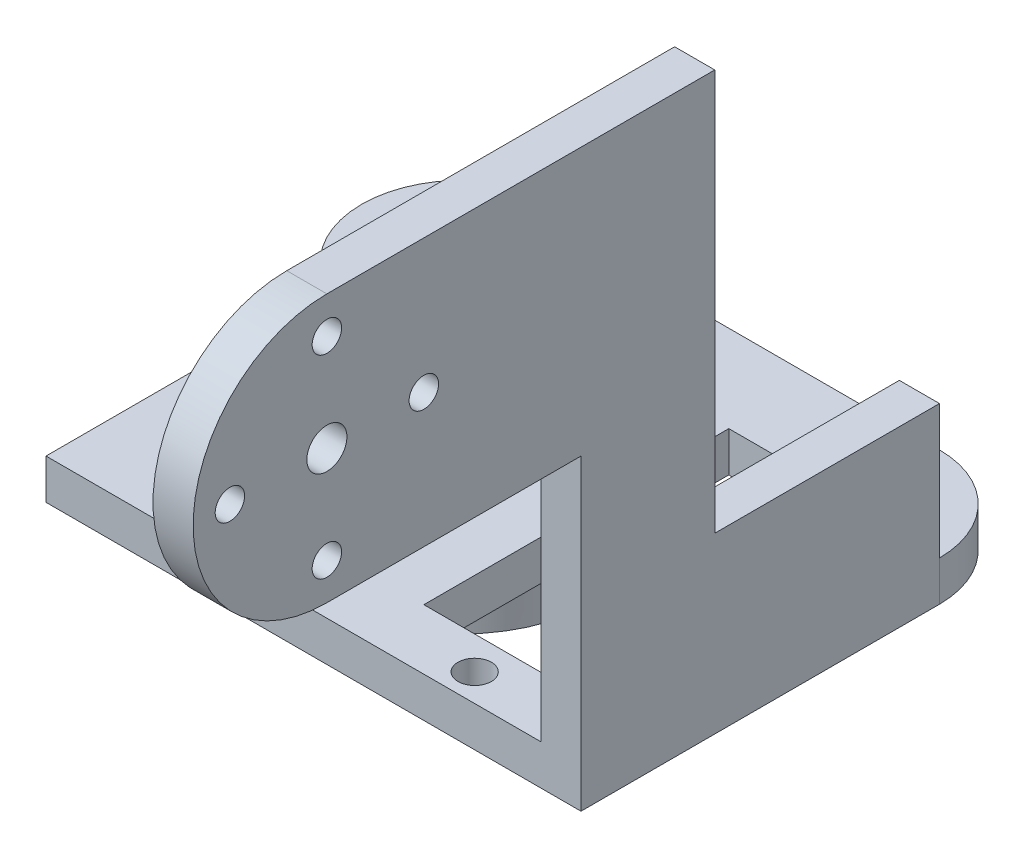
ISO-10303-21;
HEADER;
FILE_DESCRIPTION(('STEP AP214'),'2;1');
FILE_NAME('part.step','',(''),(''),'','','');
FILE_SCHEMA(('AUTOMOTIVE_DESIGN { 1 0 10303 214 1 1 1 1 }'));
ENDSEC;
DATA;
#1=APPLICATION_CONTEXT('core data for automotive mechanical design processes');
#2=APPLICATION_PROTOCOL_DEFINITION('international standard','automotive_design',2000,#1);
#3=PRODUCT_CONTEXT('',#1,'mechanical');
#4=PRODUCT('Part','Part','',(#3));
#5=PRODUCT_RELATED_PRODUCT_CATEGORY('part','',(#4));
#6=PRODUCT_DEFINITION_FORMATION('','',#4);
#7=PRODUCT_DEFINITION_CONTEXT('part definition',#1,'design');
#8=PRODUCT_DEFINITION('design','',#6,#7);
#9=PRODUCT_DEFINITION_SHAPE('','',#8);
#10=(LENGTH_UNIT() NAMED_UNIT(*) SI_UNIT(.MILLI.,.METRE.));
#11=(NAMED_UNIT(*) PLANE_ANGLE_UNIT() SI_UNIT($,.RADIAN.));
#12=(NAMED_UNIT(*) SI_UNIT($,.STERADIAN.) SOLID_ANGLE_UNIT());
#13=UNCERTAINTY_MEASURE_WITH_UNIT(LENGTH_MEASURE(1.E-05),#10,'distance_accuracy_value','');
#14=(GEOMETRIC_REPRESENTATION_CONTEXT(3) GLOBAL_UNCERTAINTY_ASSIGNED_CONTEXT((#13)) GLOBAL_UNIT_ASSIGNED_CONTEXT((#10,
#11,#12)) REPRESENTATION_CONTEXT('',''));
#15=CARTESIAN_POINT('',(0.,0.,0.));
#16=DIRECTION('',(0.,0.,1.));
#17=DIRECTION('',(1.,0.,0.));
#18=AXIS2_PLACEMENT_3D('',#15,#16,#17);
#19=CARTESIAN_POINT('',(-13.,0.,-10.9));
#20=DIRECTION('',(0.,-1.,0.));
#21=DIRECTION('',(0.,0.,-1.));
#22=AXIS2_PLACEMENT_3D('',#19,#20,#21);
#23=PLANE('',#22);
#24=CARTESIAN_POINT('',(-10.,0.,-5.2));
#25=DIRECTION('',(0.,1.,0.));
#26=DIRECTION('',(0.,0.,1.));
#27=AXIS2_PLACEMENT_3D('',#24,#25,#26);
#28=CIRCLE('',#27,4.5);
#29=CARTESIAN_POINT('',(-10.,0.,-0.700000000000002));
#30=VERTEX_POINT('',#29);
#31=EDGE_CURVE('E247',#30,#30,#28,.T.);
#32=ORIENTED_EDGE('',*,*,#31,.T.);
#33=EDGE_LOOP('',(#32));
#34=FACE_BOUND('',#33,.T.);
#35=CARTESIAN_POINT('',(-10.,0.,-5.2));
#36=DIRECTION('',(0.,-1.,0.));
#37=DIRECTION('',(0.,0.,-1.));
#38=AXIS2_PLACEMENT_3D('',#35,#36,#37);
#39=CIRCLE('',#38,7.5);
#40=CARTESIAN_POINT('',(-10.,0.,-12.7));
#41=VERTEX_POINT('',#40);
#42=EDGE_CURVE('E363',#41,#41,#39,.T.);
#43=ORIENTED_EDGE('',*,*,#42,.T.);
#44=EDGE_LOOP('',(#43));
#45=FACE_BOUND('',#44,.T.);
#46=ADVANCED_FACE('F35',(#34,#45),#23,.T.);
#47=CARTESIAN_POINT('',(-13.,3.,-10.9));
#48=DIRECTION('',(0.,-1.,0.));
#49=DIRECTION('',(0.,0.,-1.));
#50=AXIS2_PLACEMENT_3D('',#47,#48,#49);
#51=PLANE('',#50);
#52=CARTESIAN_POINT('',(10.,3.,13.85));
#53=DIRECTION('',(0.,1.,0.));
#54=DIRECTION('',(0.,0.,1.));
#55=AXIS2_PLACEMENT_3D('',#52,#53,#54);
#56=CIRCLE('',#55,1.25);
#57=CARTESIAN_POINT('',(10.,3.,15.1));
#58=VERTEX_POINT('',#57);
#59=EDGE_CURVE('E260',#58,#58,#56,.T.);
#60=ORIENTED_EDGE('',*,*,#59,.F.);
#61=EDGE_LOOP('',(#60));
#62=FACE_BOUND('',#61,.T.);
#63=CARTESIAN_POINT('',(10.,3.,-13.85));
#64=DIRECTION('',(0.,1.,0.));
#65=DIRECTION('',(0.,0.,1.));
#66=AXIS2_PLACEMENT_3D('',#63,#64,#65);
#67=CIRCLE('',#66,1.25);
#68=CARTESIAN_POINT('',(10.,3.,-12.6));
#69=VERTEX_POINT('',#68);
#70=EDGE_CURVE('E256',#69,#69,#67,.T.);
#71=ORIENTED_EDGE('',*,*,#70,.F.);
#72=EDGE_LOOP('',(#71));
#73=FACE_BOUND('',#72,.T.);
#74=DIRECTION('',(0.,0.,1.));
#75=VECTOR('',#74,1.);
#76=CARTESIAN_POINT('',(3.75,3.,-11.4));
#77=LINE('',#76,#75);
#78=CARTESIAN_POINT('',(3.75,3.,-11.4));
#79=VERTEX_POINT('',#78);
#80=CARTESIAN_POINT('',(3.75,3.,11.4));
#81=VERTEX_POINT('',#80);
#82=EDGE_CURVE('E239',#79,#81,#77,.T.);
#83=ORIENTED_EDGE('',*,*,#82,.F.);
#84=DIRECTION('',(-1.,0.,0.));
#85=VECTOR('',#84,1.);
#86=CARTESIAN_POINT('',(3.75,3.,-11.4));
#87=LINE('',#86,#85);
#88=CARTESIAN_POINT('',(16.25,3.,-11.4));
#89=VERTEX_POINT('',#88);
#90=EDGE_CURVE('E235',#89,#79,#87,.T.);
#91=ORIENTED_EDGE('',*,*,#90,.F.);
#92=DIRECTION('',(0.,0.,-1.));
#93=VECTOR('',#92,1.);
#94=CARTESIAN_POINT('',(16.25,3.,-11.4));
#95=LINE('',#94,#93);
#96=CARTESIAN_POINT('',(16.25,3.,11.4));
#97=VERTEX_POINT('',#96);
#98=EDGE_CURVE('E249',#97,#89,#95,.T.);
#99=ORIENTED_EDGE('',*,*,#98,.F.);
#100=DIRECTION('',(1.,0.,0.));
#101=VECTOR('',#100,1.);
#102=CARTESIAN_POINT('',(3.75,3.,11.4));
#103=LINE('',#102,#101);
#104=EDGE_CURVE('E251',#81,#97,#103,.T.);
#105=ORIENTED_EDGE('',*,*,#104,.F.);
#106=EDGE_LOOP('',(#83,#91,#99,#105));
#107=FACE_BOUND('',#106,.T.);
#108=DIRECTION('',(1.,0.,0.));
#109=VECTOR('',#108,1.);
#110=CARTESIAN_POINT('',(-20.,3.,15.9));
#111=LINE('',#110,#109);
#112=CARTESIAN_POINT('',(-20.,3.,15.9));
#113=VERTEX_POINT('',#112);
#114=CARTESIAN_POINT('',(17.,3.,15.9));
#115=VERTEX_POINT('',#114);
#116=EDGE_CURVE('E187',#113,#115,#111,.T.);
#117=ORIENTED_EDGE('',*,*,#116,.T.);
#118=DIRECTION('',(0.,0.,-1.));
#119=VECTOR('',#118,1.);
#120=CARTESIAN_POINT('',(17.,3.,-10.9));
#121=LINE('',#120,#119);
#122=CARTESIAN_POINT('',(17.,3.,-10.9));
#123=VERTEX_POINT('',#122);
#124=EDGE_CURVE('E272',#115,#123,#121,.T.);
#125=ORIENTED_EDGE('',*,*,#124,.T.);
#126=DIRECTION('',(1.,0.,0.));
#127=VECTOR('',#126,1.);
#128=CARTESIAN_POINT('',(17.,3.,-10.9));
#129=LINE('',#128,#127);
#130=CARTESIAN_POINT('',(20.,3.,-10.9));
#131=VERTEX_POINT('',#130);
#132=EDGE_CURVE('E266',#123,#131,#129,.T.);
#133=ORIENTED_EDGE('',*,*,#132,.T.);
#134=CARTESIAN_POINT('',(13.,3.,-10.9));
#135=DIRECTION('',(0.,1.,0.));
#136=DIRECTION('',(0.,0.,-1.));
#137=AXIS2_PLACEMENT_3D('',#134,#135,#136);
#138=CIRCLE('',#137,7.);
#139=CARTESIAN_POINT('',(13.,3.,-17.9));
#140=VERTEX_POINT('',#139);
#141=EDGE_CURVE('E182',#131,#140,#138,.T.);
#142=ORIENTED_EDGE('',*,*,#141,.T.);
#143=DIRECTION('',(-1.,0.,0.));
#144=VECTOR('',#143,1.);
#145=CARTESIAN_POINT('',(-13.,3.,-17.9));
#146=LINE('',#145,#144);
#147=CARTESIAN_POINT('',(-13.,3.,-17.9));
#148=VERTEX_POINT('',#147);
#149=EDGE_CURVE('E226',#140,#148,#146,.T.);
#150=ORIENTED_EDGE('',*,*,#149,.T.);
#151=CARTESIAN_POINT('',(-13.,3.,-10.9));
#152=DIRECTION('',(0.,1.,0.));
#153=DIRECTION('',(0.,0.,-1.));
#154=AXIS2_PLACEMENT_3D('',#151,#152,#153);
#155=CIRCLE('',#154,7.);
#156=CARTESIAN_POINT('',(-20.,3.,-10.9));
#157=VERTEX_POINT('',#156);
#158=EDGE_CURVE('E223',#148,#157,#155,.T.);
#159=ORIENTED_EDGE('',*,*,#158,.T.);
#160=DIRECTION('',(0.,0.,1.));
#161=VECTOR('',#160,1.);
#162=CARTESIAN_POINT('',(-20.,3.,15.9));
#163=LINE('',#162,#161);
#164=EDGE_CURVE('E225',#157,#113,#163,.T.);
#165=ORIENTED_EDGE('',*,*,#164,.T.);
#166=EDGE_LOOP('',(#117,#125,#133,#142,#150,#159,#165));
#167=FACE_BOUND('',#166,.T.);
#168=CARTESIAN_POINT('',(-10.,3.,-5.2));
#169=DIRECTION('',(0.,-1.,0.));
#170=DIRECTION('',(0.,0.,-1.));
#171=AXIS2_PLACEMENT_3D('',#168,#169,#170);
#172=CIRCLE('',#171,7.5);
#173=CARTESIAN_POINT('',(-10.,3.,-12.7));
#174=VERTEX_POINT('',#173);
#175=EDGE_CURVE('E11',#174,#174,#172,.F.);
#176=ORIENTED_EDGE('',*,*,#175,.F.);
#177=EDGE_LOOP('',(#176));
#178=FACE_BOUND('',#177,.T.);
#179=ADVANCED_FACE('F389',(#62,#73,#107,#167,#178),#51,.F.);
#180=CARTESIAN_POINT('',(10.,0.,-13.85));
#181=DIRECTION('',(0.,1.,0.));
#182=DIRECTION('',(0.,0.,1.));
#183=AXIS2_PLACEMENT_3D('',#180,#181,#182);
#184=CIRCLE('',#183,1.25);
#185=CARTESIAN_POINT('',(10.,0.,-12.6));
#186=VERTEX_POINT('',#185);
#187=EDGE_CURVE('E257',#186,#186,#184,.T.);
#188=ORIENTED_EDGE('',*,*,#187,.T.);
#189=EDGE_LOOP('',(#188));
#190=FACE_BOUND('',#189,.T.);
#191=DIRECTION('',(-1.,0.,0.));
#192=VECTOR('',#191,1.);
#193=CARTESIAN_POINT('',(3.75,0.,-11.4));
#194=LINE('',#193,#192);
#195=CARTESIAN_POINT('',(16.25,0.,-11.4));
#196=VERTEX_POINT('',#195);
#197=CARTESIAN_POINT('',(3.75000000000001,0.,-11.4));
#198=VERTEX_POINT('',#197);
#199=EDGE_CURVE('E236',#196,#198,#194,.T.);
#200=ORIENTED_EDGE('',*,*,#199,.T.);
#201=DIRECTION('',(0.,0.,1.));
#202=VECTOR('',#201,1.);
#203=CARTESIAN_POINT('',(3.75,0.,-11.4));
#204=LINE('',#203,#202);
#205=CARTESIAN_POINT('',(3.75,0.,11.4));
#206=VERTEX_POINT('',#205);
#207=EDGE_CURVE('E58',#198,#206,#204,.T.);
#208=ORIENTED_EDGE('',*,*,#207,.T.);
#209=DIRECTION('',(1.,0.,0.));
#210=VECTOR('',#209,1.);
#211=CARTESIAN_POINT('',(3.75,0.,11.4));
#212=LINE('',#211,#210);
#213=CARTESIAN_POINT('',(16.25,0.,11.4));
#214=VERTEX_POINT('',#213);
#215=EDGE_CURVE('E243',#206,#214,#212,.T.);
#216=ORIENTED_EDGE('',*,*,#215,.T.);
#217=DIRECTION('',(0.,0.,-1.));
#218=VECTOR('',#217,1.);
#219=CARTESIAN_POINT('',(16.25,0.,-11.4));
#220=LINE('',#219,#218);
#221=EDGE_CURVE('E240',#214,#196,#220,.T.);
#222=ORIENTED_EDGE('',*,*,#221,.T.);
#223=EDGE_LOOP('',(#200,#208,#216,#222));
#224=FACE_BOUND('',#223,.T.);
#225=DIRECTION('',(0.,0.,1.));
#226=VECTOR('',#225,1.);
#227=CARTESIAN_POINT('',(-20.,0.,15.9));
#228=LINE('',#227,#226);
#229=CARTESIAN_POINT('',(-20.,0.,-5.2));
#230=VERTEX_POINT('',#229);
#231=CARTESIAN_POINT('',(-20.,0.,15.9));
#232=VERTEX_POINT('',#231);
#233=EDGE_CURVE('E160',#230,#232,#228,.T.);
#234=ORIENTED_EDGE('',*,*,#233,.F.);
#235=CARTESIAN_POINT('',(-10.,0.,-5.2));
#236=DIRECTION('',(0.,-1.,0.));
#237=DIRECTION('',(0.,0.,-1.));
#238=AXIS2_PLACEMENT_3D('',#235,#236,#237);
#239=CIRCLE('',#238,10.);
#240=EDGE_CURVE('E174',#230,#230,#239,.T.);
#241=ORIENTED_EDGE('',*,*,#240,.F.);
#242=CARTESIAN_POINT('',(-20.,0.,-10.9));
#243=VERTEX_POINT('',#242);
#244=EDGE_CURVE('E156',#243,#230,#228,.T.);
#245=ORIENTED_EDGE('',*,*,#244,.F.);
#246=CARTESIAN_POINT('',(-13.,0.,-10.9));
#247=DIRECTION('',(0.,1.,0.));
#248=DIRECTION('',(0.,0.,-1.));
#249=AXIS2_PLACEMENT_3D('',#246,#247,#248);
#250=CIRCLE('',#249,7.);
#251=CARTESIAN_POINT('',(-13.,0.,-17.9));
#252=VERTEX_POINT('',#251);
#253=EDGE_CURVE('E176',#252,#243,#250,.T.);
#254=ORIENTED_EDGE('',*,*,#253,.F.);
#255=DIRECTION('',(-1.,0.,0.));
#256=VECTOR('',#255,1.);
#257=CARTESIAN_POINT('',(-13.,0.,-17.9));
#258=LINE('',#257,#256);
#259=CARTESIAN_POINT('',(13.,0.,-17.9));
#260=VERTEX_POINT('',#259);
#261=EDGE_CURVE('E177',#260,#252,#258,.T.);
#262=ORIENTED_EDGE('',*,*,#261,.F.);
#263=CARTESIAN_POINT('',(13.,0.,-10.9));
#264=DIRECTION('',(0.,1.,0.));
#265=DIRECTION('',(0.,0.,-1.));
#266=AXIS2_PLACEMENT_3D('',#263,#264,#265);
#267=CIRCLE('',#266,7.);
#268=CARTESIAN_POINT('',(20.,0.,-10.9));
#269=VERTEX_POINT('',#268);
#270=EDGE_CURVE('E202',#269,#260,#267,.T.);
#271=ORIENTED_EDGE('',*,*,#270,.F.);
#272=DIRECTION('',(0.,0.,-1.));
#273=VECTOR('',#272,1.);
#274=CARTESIAN_POINT('',(20.,0.,-10.9));
#275=LINE('',#274,#273);
#276=CARTESIAN_POINT('',(20.,0.,15.9));
#277=VERTEX_POINT('',#276);
#278=EDGE_CURVE('E205',#277,#269,#275,.T.);
#279=ORIENTED_EDGE('',*,*,#278,.F.);
#280=DIRECTION('',(1.,0.,0.));
#281=VECTOR('',#280,1.);
#282=CARTESIAN_POINT('',(-20.,0.,15.9));
#283=LINE('',#282,#281);
#284=EDGE_CURVE('E168',#232,#277,#283,.T.);
#285=ORIENTED_EDGE('',*,*,#284,.F.);
#286=EDGE_LOOP('',(#234,#241,#245,#254,#262,#271,#279,#285));
#287=FACE_BOUND('',#286,.T.);
#288=CARTESIAN_POINT('',(10.,0.,13.85));
#289=DIRECTION('',(0.,1.,0.));
#290=DIRECTION('',(0.,0.,1.));
#291=AXIS2_PLACEMENT_3D('',#288,#289,#290);
#292=CIRCLE('',#291,1.25);
#293=CARTESIAN_POINT('',(10.,0.,15.1));
#294=VERTEX_POINT('',#293);
#295=EDGE_CURVE('E263',#294,#294,#292,.T.);
#296=ORIENTED_EDGE('',*,*,#295,.T.);
#297=EDGE_LOOP('',(#296));
#298=FACE_BOUND('',#297,.T.);
#299=ADVANCED_FACE('F171',(#190,#224,#287,#298),#23,.T.);
#300=CARTESIAN_POINT('',(20.,3.,-10.9));
#301=DIRECTION('',(-1.,0.,0.));
#302=DIRECTION('',(0.,0.,1.));
#303=AXIS2_PLACEMENT_3D('',#300,#301,#302);
#304=PLANE('',#303);
#305=ORIENTED_EDGE('',*,*,#278,.T.);
#306=DIRECTION('',(0.,-1.,0.));
#307=VECTOR('',#306,1.);
#308=CARTESIAN_POINT('',(20.,3.,-10.9));
#309=LINE('',#308,#307);
#310=EDGE_CURVE('E43',#131,#269,#309,.T.);
#311=ORIENTED_EDGE('',*,*,#310,.F.);
#312=DIRECTION('',(0.,1.,0.));
#313=VECTOR('',#312,1.);
#314=CARTESIAN_POINT('',(20.,3.,-10.9));
#315=LINE('',#314,#313);
#316=CARTESIAN_POINT('',(20.,13.,-10.9));
#317=VERTEX_POINT('',#316);
#318=EDGE_CURVE('E300',#131,#317,#315,.T.);
#319=ORIENTED_EDGE('',*,*,#318,.T.);
#320=DIRECTION('',(0.,0.,1.));
#321=VECTOR('',#320,1.);
#322=CARTESIAN_POINT('',(20.,13.,-10.9));
#323=LINE('',#322,#321);
#324=CARTESIAN_POINT('',(20.,13.,5.9));
#325=VERTEX_POINT('',#324);
#326=EDGE_CURVE('E297',#317,#325,#323,.T.);
#327=ORIENTED_EDGE('',*,*,#326,.T.);
#328=DIRECTION('',(0.,1.,0.));
#329=VECTOR('',#328,1.);
#330=CARTESIAN_POINT('',(20.,3.,5.9));
#331=LINE('',#330,#329);
#332=CARTESIAN_POINT('',(20.,43.,5.9));
#333=VERTEX_POINT('',#332);
#334=EDGE_CURVE('E294',#325,#333,#331,.T.);
#335=ORIENTED_EDGE('',*,*,#334,.T.);
#336=DIRECTION('',(0.,0.,1.));
#337=VECTOR('',#336,1.);
#338=CARTESIAN_POINT('',(20.,43.,-10.9));
#339=LINE('',#338,#337);
#340=CARTESIAN_POINT('',(20.,43.,34.9));
#341=VERTEX_POINT('',#340);
#342=EDGE_CURVE('E291',#333,#341,#339,.T.);
#343=ORIENTED_EDGE('',*,*,#342,.T.);
#344=CARTESIAN_POINT('',(20.,33.,34.9));
#345=DIRECTION('',(-1.,0.,0.));
#346=DIRECTION('',(0.,0.,1.));
#347=AXIS2_PLACEMENT_3D('',#344,#345,#346);
#348=CIRCLE('',#347,10.);
#349=CARTESIAN_POINT('',(20.,23.,34.9));
#350=VERTEX_POINT('',#349);
#351=EDGE_CURVE('E288',#350,#341,#348,.T.);
#352=ORIENTED_EDGE('',*,*,#351,.F.);
#353=DIRECTION('',(0.,0.,-1.));
#354=VECTOR('',#353,1.);
#355=CARTESIAN_POINT('',(20.,23.,-10.9));
#356=LINE('',#355,#354);
#357=CARTESIAN_POINT('',(20.,23.,15.9));
#358=VERTEX_POINT('',#357);
#359=EDGE_CURVE('E285',#350,#358,#356,.T.);
#360=ORIENTED_EDGE('',*,*,#359,.T.);
#361=DIRECTION('',(0.,-1.,0.));
#362=VECTOR('',#361,1.);
#363=CARTESIAN_POINT('',(20.,3.,15.9));
#364=LINE('',#363,#362);
#365=EDGE_CURVE('E183',#358,#277,#364,.T.);
#366=ORIENTED_EDGE('',*,*,#365,.T.);
#367=EDGE_LOOP('',(#305,#311,#319,#327,#335,#343,#352,#360,#366));
#368=FACE_BOUND('',#367,.T.);
#369=CARTESIAN_POINT('',(20.,33.,42.15));
#370=DIRECTION('',(-1.,0.,0.));
#371=DIRECTION('',(0.,0.,1.));
#372=AXIS2_PLACEMENT_3D('',#369,#370,#371);
#373=CIRCLE('',#372,1.1);
#374=CARTESIAN_POINT('',(20.,33.,43.25));
#375=VERTEX_POINT('',#374);
#376=EDGE_CURVE('E323',#375,#375,#373,.T.);
#377=ORIENTED_EDGE('',*,*,#376,.T.);
#378=EDGE_LOOP('',(#377));
#379=FACE_BOUND('',#378,.T.);
#380=CARTESIAN_POINT('',(20.,33.,34.9));
#381=DIRECTION('',(-1.,0.,0.));
#382=DIRECTION('',(0.,0.,1.));
#383=AXIS2_PLACEMENT_3D('',#380,#381,#382);
#384=CIRCLE('',#383,1.5);
#385=CARTESIAN_POINT('',(20.,33.,36.4));
#386=VERTEX_POINT('',#385);
#387=EDGE_CURVE('E329',#386,#386,#384,.T.);
#388=ORIENTED_EDGE('',*,*,#387,.T.);
#389=EDGE_LOOP('',(#388));
#390=FACE_BOUND('',#389,.T.);
#391=CARTESIAN_POINT('',(20.,40.25,34.9));
#392=DIRECTION('',(-1.,0.,0.));
#393=DIRECTION('',(0.,0.,1.));
#394=AXIS2_PLACEMENT_3D('',#391,#392,#393);
#395=CIRCLE('',#394,1.1);
#396=CARTESIAN_POINT('',(20.,40.25,36.));
#397=VERTEX_POINT('',#396);
#398=EDGE_CURVE('E335',#397,#397,#395,.T.);
#399=ORIENTED_EDGE('',*,*,#398,.T.);
#400=EDGE_LOOP('',(#399));
#401=FACE_BOUND('',#400,.T.);
#402=CARTESIAN_POINT('',(20.,33.,27.65));
#403=DIRECTION('',(-1.,0.,0.));
#404=DIRECTION('',(0.,0.,1.));
#405=AXIS2_PLACEMENT_3D('',#402,#403,#404);
#406=CIRCLE('',#405,1.1);
#407=CARTESIAN_POINT('',(20.,33.,28.75));
#408=VERTEX_POINT('',#407);
#409=EDGE_CURVE('E341',#408,#408,#406,.T.);
#410=ORIENTED_EDGE('',*,*,#409,.T.);
#411=EDGE_LOOP('',(#410));
#412=FACE_BOUND('',#411,.T.);
#413=CARTESIAN_POINT('',(20.,25.75,34.9));
#414=DIRECTION('',(-1.,0.,0.));
#415=DIRECTION('',(0.,0.,1.));
#416=AXIS2_PLACEMENT_3D('',#413,#414,#415);
#417=CIRCLE('',#416,1.1);
#418=CARTESIAN_POINT('',(20.,25.75,36.));
#419=VERTEX_POINT('',#418);
#420=EDGE_CURVE('E347',#419,#419,#417,.T.);
#421=ORIENTED_EDGE('',*,*,#420,.T.);
#422=EDGE_LOOP('',(#421));
#423=FACE_BOUND('',#422,.T.);
#424=ADVANCED_FACE('F37',(#368,#379,#390,#401,#412,#423),#304,.F.);
#425=CARTESIAN_POINT('',(13.,3.,-10.9));
#426=DIRECTION('',(0.,-1.,0.));
#427=DIRECTION('',(0.,0.,-1.));
#428=AXIS2_PLACEMENT_3D('',#425,#426,#427);
#429=CYLINDRICAL_SURFACE('',#428,7.);
#430=ORIENTED_EDGE('',*,*,#270,.T.);
#431=DIRECTION('',(0.,-1.,0.));
#432=VECTOR('',#431,1.);
#433=CARTESIAN_POINT('',(13.,3.,-17.9));
#434=LINE('',#433,#432);
#435=EDGE_CURVE('E193',#140,#260,#434,.T.);
#436=ORIENTED_EDGE('',*,*,#435,.F.);
#437=ORIENTED_EDGE('',*,*,#141,.F.);
#438=ORIENTED_EDGE('',*,*,#310,.T.);
#439=EDGE_LOOP('',(#430,#436,#437,#438));
#440=FACE_BOUND('',#439,.T.);
#441=ADVANCED_FACE('F200',(#440),#429,.T.);
#442=CARTESIAN_POINT('',(-13.,3.,-17.9));
#443=DIRECTION('',(0.,0.,1.));
#444=DIRECTION('',(1.,0.,0.));
#445=AXIS2_PLACEMENT_3D('',#442,#443,#444);
#446=PLANE('',#445);
#447=ORIENTED_EDGE('',*,*,#261,.T.);
#448=DIRECTION('',(0.,-1.,0.));
#449=VECTOR('',#448,1.);
#450=CARTESIAN_POINT('',(-13.,3.,-17.9));
#451=LINE('',#450,#449);
#452=EDGE_CURVE('E190',#148,#252,#451,.T.);
#453=ORIENTED_EDGE('',*,*,#452,.F.);
#454=ORIENTED_EDGE('',*,*,#149,.F.);
#455=ORIENTED_EDGE('',*,*,#435,.T.);
#456=EDGE_LOOP('',(#447,#453,#454,#455));
#457=FACE_BOUND('',#456,.T.);
#458=ADVANCED_FACE('F218',(#457),#446,.F.);
#459=CARTESIAN_POINT('',(-13.,3.,-10.9));
#460=DIRECTION('',(0.,-1.,0.));
#461=DIRECTION('',(0.,0.,-1.));
#462=AXIS2_PLACEMENT_3D('',#459,#460,#461);
#463=CYLINDRICAL_SURFACE('',#462,7.);
#464=ORIENTED_EDGE('',*,*,#253,.T.);
#465=DIRECTION('',(0.,-1.,0.));
#466=VECTOR('',#465,1.);
#467=CARTESIAN_POINT('',(-20.,3.,-10.9));
#468=LINE('',#467,#466);
#469=EDGE_CURVE('E164',#157,#243,#468,.T.);
#470=ORIENTED_EDGE('',*,*,#469,.F.);
#471=ORIENTED_EDGE('',*,*,#158,.F.);
#472=ORIENTED_EDGE('',*,*,#452,.T.);
#473=EDGE_LOOP('',(#464,#470,#471,#472));
#474=FACE_BOUND('',#473,.T.);
#475=ADVANCED_FACE('F222',(#474),#463,.T.);
#476=CARTESIAN_POINT('',(-20.,3.,15.9));
#477=DIRECTION('',(1.,0.,0.));
#478=DIRECTION('',(0.,0.,-1.));
#479=AXIS2_PLACEMENT_3D('',#476,#477,#478);
#480=PLANE('',#479);
#481=ORIENTED_EDGE('',*,*,#244,.T.);
#482=ORIENTED_EDGE('',*,*,#233,.T.);
#483=DIRECTION('',(0.,-1.,0.));
#484=VECTOR('',#483,1.);
#485=CARTESIAN_POINT('',(-20.,3.,15.9));
#486=LINE('',#485,#484);
#487=EDGE_CURVE('E186',#113,#232,#486,.T.);
#488=ORIENTED_EDGE('',*,*,#487,.F.);
#489=ORIENTED_EDGE('',*,*,#164,.F.);
#490=ORIENTED_EDGE('',*,*,#469,.T.);
#491=EDGE_LOOP('',(#481,#482,#488,#489,#490));
#492=FACE_BOUND('',#491,.T.);
#493=ADVANCED_FACE('F158',(#492),#480,.F.);
#494=CARTESIAN_POINT('',(-20.,3.,15.9));
#495=DIRECTION('',(0.,0.,-1.));
#496=DIRECTION('',(-1.,0.,0.));
#497=AXIS2_PLACEMENT_3D('',#494,#495,#496);
#498=PLANE('',#497);
#499=ORIENTED_EDGE('',*,*,#284,.T.);
#500=ORIENTED_EDGE('',*,*,#365,.F.);
#501=DIRECTION('',(1.,0.,0.));
#502=VECTOR('',#501,1.);
#503=CARTESIAN_POINT('',(17.,23.,15.9));
#504=LINE('',#503,#502);
#505=CARTESIAN_POINT('',(17.,23.,15.9));
#506=VERTEX_POINT('',#505);
#507=EDGE_CURVE('E280',#506,#358,#504,.T.);
#508=ORIENTED_EDGE('',*,*,#507,.F.);
#509=DIRECTION('',(0.,-1.,0.));
#510=VECTOR('',#509,1.);
#511=CARTESIAN_POINT('',(17.,3.,15.9));
#512=LINE('',#511,#510);
#513=EDGE_CURVE('E305',#506,#115,#512,.T.);
#514=ORIENTED_EDGE('',*,*,#513,.T.);
#515=ORIENTED_EDGE('',*,*,#116,.F.);
#516=ORIENTED_EDGE('',*,*,#487,.T.);
#517=EDGE_LOOP('',(#499,#500,#508,#514,#515,#516));
#518=FACE_BOUND('',#517,.T.);
#519=ADVANCED_FACE('F432',(#518),#498,.F.);
#520=CARTESIAN_POINT('',(3.75,3.,-11.4));
#521=DIRECTION('',(1.,0.,0.));
#522=DIRECTION('',(0.,0.,-1.));
#523=AXIS2_PLACEMENT_3D('',#520,#521,#522);
#524=PLANE('',#523);
#525=ORIENTED_EDGE('',*,*,#207,.F.);
#526=DIRECTION('',(0.,-1.,0.));
#527=VECTOR('',#526,1.);
#528=CARTESIAN_POINT('',(3.75,3.,-11.4));
#529=LINE('',#528,#527);
#530=EDGE_CURVE('E233',#79,#198,#529,.T.);
#531=ORIENTED_EDGE('',*,*,#530,.F.);
#532=ORIENTED_EDGE('',*,*,#82,.T.);
#533=DIRECTION('',(0.,-1.,0.));
#534=VECTOR('',#533,1.);
#535=CARTESIAN_POINT('',(3.75,3.,11.4));
#536=LINE('',#535,#534);
#537=EDGE_CURVE('E208',#81,#206,#536,.T.);
#538=ORIENTED_EDGE('',*,*,#537,.T.);
#539=EDGE_LOOP('',(#525,#531,#532,#538));
#540=FACE_BOUND('',#539,.T.);
#541=ADVANCED_FACE('F410',(#540),#524,.T.);
#542=CARTESIAN_POINT('',(3.75,3.,11.4));
#543=DIRECTION('',(0.,0.,-1.));
#544=DIRECTION('',(-1.,0.,0.));
#545=AXIS2_PLACEMENT_3D('',#542,#543,#544);
#546=PLANE('',#545);
#547=ORIENTED_EDGE('',*,*,#215,.F.);
#548=ORIENTED_EDGE('',*,*,#537,.F.);
#549=ORIENTED_EDGE('',*,*,#104,.T.);
#550=DIRECTION('',(0.,-1.,0.));
#551=VECTOR('',#550,1.);
#552=CARTESIAN_POINT('',(16.25,3.,11.4));
#553=LINE('',#552,#551);
#554=EDGE_CURVE('E211',#97,#214,#553,.T.);
#555=ORIENTED_EDGE('',*,*,#554,.T.);
#556=EDGE_LOOP('',(#547,#548,#549,#555));
#557=FACE_BOUND('',#556,.T.);
#558=ADVANCED_FACE('F417',(#557),#546,.T.);
#559=CARTESIAN_POINT('',(16.25,3.,-11.4));
#560=DIRECTION('',(-1.,0.,0.));
#561=DIRECTION('',(0.,0.,1.));
#562=AXIS2_PLACEMENT_3D('',#559,#560,#561);
#563=PLANE('',#562);
#564=ORIENTED_EDGE('',*,*,#221,.F.);
#565=ORIENTED_EDGE('',*,*,#554,.F.);
#566=ORIENTED_EDGE('',*,*,#98,.T.);
#567=DIRECTION('',(0.,-1.,0.));
#568=VECTOR('',#567,1.);
#569=CARTESIAN_POINT('',(16.25,3.,-11.4));
#570=LINE('',#569,#568);
#571=EDGE_CURVE('E50',#89,#196,#570,.T.);
#572=ORIENTED_EDGE('',*,*,#571,.T.);
#573=EDGE_LOOP('',(#564,#565,#566,#572));
#574=FACE_BOUND('',#573,.T.);
#575=ADVANCED_FACE('F419',(#574),#563,.T.);
#576=CARTESIAN_POINT('',(3.75,3.,-11.4));
#577=DIRECTION('',(0.,0.,1.));
#578=DIRECTION('',(1.,0.,0.));
#579=AXIS2_PLACEMENT_3D('',#576,#577,#578);
#580=PLANE('',#579);
#581=ORIENTED_EDGE('',*,*,#199,.F.);
#582=ORIENTED_EDGE('',*,*,#571,.F.);
#583=ORIENTED_EDGE('',*,*,#90,.T.);
#584=ORIENTED_EDGE('',*,*,#530,.T.);
#585=EDGE_LOOP('',(#581,#582,#583,#584));
#586=FACE_BOUND('',#585,.T.);
#587=ADVANCED_FACE('F407',(#586),#580,.T.);
#588=CARTESIAN_POINT('',(-10.,3.,-5.2));
#589=DIRECTION('',(0.,-1.,0.));
#590=DIRECTION('',(0.,0.,-1.));
#591=AXIS2_PLACEMENT_3D('',#588,#589,#590);
#592=CYLINDRICAL_SURFACE('',#591,4.5);
#593=ORIENTED_EDGE('',*,*,#31,.F.);
#594=EDGE_LOOP('',(#593));
#595=FACE_BOUND('',#594,.T.);
#596=CARTESIAN_POINT('',(-10.,10.,-5.2));
#597=DIRECTION('',(0.,1.,0.));
#598=DIRECTION('',(0.,0.,1.));
#599=AXIS2_PLACEMENT_3D('',#596,#597,#598);
#600=CIRCLE('',#599,4.5);
#601=CARTESIAN_POINT('',(-10.,10.,-0.700000000000002));
#602=VERTEX_POINT('',#601);
#603=EDGE_CURVE('E355',#602,#602,#600,.T.);
#604=ORIENTED_EDGE('',*,*,#603,.T.);
#605=EDGE_LOOP('',(#604));
#606=FACE_BOUND('',#605,.T.);
#607=ADVANCED_FACE('F426',(#595,#606),#592,.F.);
#608=CARTESIAN_POINT('',(10.,3.,-13.85));
#609=DIRECTION('',(0.,-1.,0.));
#610=DIRECTION('',(0.,0.,-1.));
#611=AXIS2_PLACEMENT_3D('',#608,#609,#610);
#612=CYLINDRICAL_SURFACE('',#611,1.25);
#613=ORIENTED_EDGE('',*,*,#70,.T.);
#614=EDGE_LOOP('',(#613));
#615=FACE_BOUND('',#614,.T.);
#616=ORIENTED_EDGE('',*,*,#187,.F.);
#617=EDGE_LOOP('',(#616));
#618=FACE_BOUND('',#617,.T.);
#619=ADVANCED_FACE('F511',(#615,#618),#612,.F.);
#620=CARTESIAN_POINT('',(10.,3.,13.85));
#621=DIRECTION('',(0.,-1.,0.));
#622=DIRECTION('',(0.,0.,-1.));
#623=AXIS2_PLACEMENT_3D('',#620,#621,#622);
#624=CYLINDRICAL_SURFACE('',#623,1.25);
#625=ORIENTED_EDGE('',*,*,#59,.T.);
#626=EDGE_LOOP('',(#625));
#627=FACE_BOUND('',#626,.T.);
#628=ORIENTED_EDGE('',*,*,#295,.F.);
#629=EDGE_LOOP('',(#628));
#630=FACE_BOUND('',#629,.T.);
#631=ADVANCED_FACE('F627',(#627,#630),#624,.F.);
#632=CARTESIAN_POINT('',(17.,33.,34.9));
#633=DIRECTION('',(-1.,0.,0.));
#634=DIRECTION('',(0.,0.,1.));
#635=AXIS2_PLACEMENT_3D('',#632,#633,#634);
#636=PLANE('',#635);
#637=CARTESIAN_POINT('',(17.,33.,27.65));
#638=DIRECTION('',(-1.,0.,0.));
#639=DIRECTION('',(0.,0.,1.));
#640=AXIS2_PLACEMENT_3D('',#637,#638,#639);
#641=CIRCLE('',#640,1.1);
#642=CARTESIAN_POINT('',(17.,33.,28.75));
#643=VERTEX_POINT('',#642);
#644=EDGE_CURVE('E338',#643,#643,#641,.T.);
#645=ORIENTED_EDGE('',*,*,#644,.F.);
#646=EDGE_LOOP('',(#645));
#647=FACE_BOUND('',#646,.T.);
#648=CARTESIAN_POINT('',(17.,33.,34.9));
#649=DIRECTION('',(-1.,0.,0.));
#650=DIRECTION('',(0.,0.,1.));
#651=AXIS2_PLACEMENT_3D('',#648,#649,#650);
#652=CIRCLE('',#651,1.5);
#653=CARTESIAN_POINT('',(17.,33.,36.4));
#654=VERTEX_POINT('',#653);
#655=EDGE_CURVE('E326',#654,#654,#652,.T.);
#656=ORIENTED_EDGE('',*,*,#655,.F.);
#657=EDGE_LOOP('',(#656));
#658=FACE_BOUND('',#657,.T.);
#659=DIRECTION('',(0.,1.,0.));
#660=VECTOR('',#659,1.);
#661=CARTESIAN_POINT('',(17.,3.,-10.9));
#662=LINE('',#661,#660);
#663=CARTESIAN_POINT('',(17.,13.,-10.9));
#664=VERTEX_POINT('',#663);
#665=EDGE_CURVE('E287',#123,#664,#662,.T.);
#666=ORIENTED_EDGE('',*,*,#665,.F.);
#667=ORIENTED_EDGE('',*,*,#124,.F.);
#668=ORIENTED_EDGE('',*,*,#513,.F.);
#669=DIRECTION('',(0.,0.,-1.));
#670=VECTOR('',#669,1.);
#671=CARTESIAN_POINT('',(17.,23.,-10.9));
#672=LINE('',#671,#670);
#673=CARTESIAN_POINT('',(17.,23.,34.9));
#674=VERTEX_POINT('',#673);
#675=EDGE_CURVE('E307',#674,#506,#672,.T.);
#676=ORIENTED_EDGE('',*,*,#675,.F.);
#677=CARTESIAN_POINT('',(17.,33.,34.9));
#678=DIRECTION('',(-1.,0.,0.));
#679=DIRECTION('',(0.,0.,1.));
#680=AXIS2_PLACEMENT_3D('',#677,#678,#679);
#681=CIRCLE('',#680,10.);
#682=CARTESIAN_POINT('',(17.,43.,34.9));
#683=VERTEX_POINT('',#682);
#684=EDGE_CURVE('E310',#674,#683,#681,.T.);
#685=ORIENTED_EDGE('',*,*,#684,.T.);
#686=DIRECTION('',(0.,0.,1.));
#687=VECTOR('',#686,1.);
#688=CARTESIAN_POINT('',(17.,43.,-10.9));
#689=LINE('',#688,#687);
#690=CARTESIAN_POINT('',(17.,43.,5.9));
#691=VERTEX_POINT('',#690);
#692=EDGE_CURVE('E312',#691,#683,#689,.T.);
#693=ORIENTED_EDGE('',*,*,#692,.F.);
#694=DIRECTION('',(0.,1.,0.));
#695=VECTOR('',#694,1.);
#696=CARTESIAN_POINT('',(17.,3.,5.9));
#697=LINE('',#696,#695);
#698=CARTESIAN_POINT('',(17.,13.,5.9));
#699=VERTEX_POINT('',#698);
#700=EDGE_CURVE('E315',#699,#691,#697,.T.);
#701=ORIENTED_EDGE('',*,*,#700,.F.);
#702=DIRECTION('',(0.,0.,1.));
#703=VECTOR('',#702,1.);
#704=CARTESIAN_POINT('',(17.,13.,-10.9));
#705=LINE('',#704,#703);
#706=EDGE_CURVE('E318',#664,#699,#705,.T.);
#707=ORIENTED_EDGE('',*,*,#706,.F.);
#708=EDGE_LOOP('',(#666,#667,#668,#676,#685,#693,#701,#707));
#709=FACE_BOUND('',#708,.T.);
#710=CARTESIAN_POINT('',(17.,33.,42.15));
#711=DIRECTION('',(-1.,0.,0.));
#712=DIRECTION('',(0.,0.,1.));
#713=AXIS2_PLACEMENT_3D('',#710,#711,#712);
#714=CIRCLE('',#713,1.1);
#715=CARTESIAN_POINT('',(17.,33.,43.25));
#716=VERTEX_POINT('',#715);
#717=EDGE_CURVE('E302',#716,#716,#714,.T.);
#718=ORIENTED_EDGE('',*,*,#717,.F.);
#719=EDGE_LOOP('',(#718));
#720=FACE_BOUND('',#719,.T.);
#721=CARTESIAN_POINT('',(17.,40.25,34.9));
#722=DIRECTION('',(-1.,0.,0.));
#723=DIRECTION('',(0.,0.,1.));
#724=AXIS2_PLACEMENT_3D('',#721,#722,#723);
#725=CIRCLE('',#724,1.1);
#726=CARTESIAN_POINT('',(17.,40.25,36.));
#727=VERTEX_POINT('',#726);
#728=EDGE_CURVE('E332',#727,#727,#725,.T.);
#729=ORIENTED_EDGE('',*,*,#728,.F.);
#730=EDGE_LOOP('',(#729));
#731=FACE_BOUND('',#730,.T.);
#732=CARTESIAN_POINT('',(17.,25.75,34.9));
#733=DIRECTION('',(-1.,0.,0.));
#734=DIRECTION('',(0.,0.,1.));
#735=AXIS2_PLACEMENT_3D('',#732,#733,#734);
#736=CIRCLE('',#735,1.1);
#737=CARTESIAN_POINT('',(17.,25.75,36.));
#738=VERTEX_POINT('',#737);
#739=EDGE_CURVE('E344',#738,#738,#736,.T.);
#740=ORIENTED_EDGE('',*,*,#739,.F.);
#741=EDGE_LOOP('',(#740));
#742=FACE_BOUND('',#741,.T.);
#743=ADVANCED_FACE('F618',(#647,#658,#709,#720,#731,#742),#636,.T.);
#744=CARTESIAN_POINT('',(17.,3.,-10.9));
#745=DIRECTION('',(0.,0.,-1.));
#746=DIRECTION('',(-1.,0.,0.));
#747=AXIS2_PLACEMENT_3D('',#744,#745,#746);
#748=PLANE('',#747);
#749=ORIENTED_EDGE('',*,*,#318,.F.);
#750=ORIENTED_EDGE('',*,*,#132,.F.);
#751=ORIENTED_EDGE('',*,*,#665,.T.);
#752=DIRECTION('',(1.,0.,0.));
#753=VECTOR('',#752,1.);
#754=CARTESIAN_POINT('',(17.,13.,-10.9));
#755=LINE('',#754,#753);
#756=EDGE_CURVE('E269',#664,#317,#755,.T.);
#757=ORIENTED_EDGE('',*,*,#756,.T.);
#758=EDGE_LOOP('',(#749,#750,#751,#757));
#759=FACE_BOUND('',#758,.T.);
#760=ADVANCED_FACE('F609',(#759),#748,.T.);
#761=CARTESIAN_POINT('',(17.,23.,-10.9));
#762=DIRECTION('',(0.,-1.,0.));
#763=DIRECTION('',(0.,0.,-1.));
#764=AXIS2_PLACEMENT_3D('',#761,#762,#763);
#765=PLANE('',#764);
#766=ORIENTED_EDGE('',*,*,#359,.F.);
#767=DIRECTION('',(1.,0.,0.));
#768=VECTOR('',#767,1.);
#769=CARTESIAN_POINT('',(17.,23.,34.9));
#770=LINE('',#769,#768);
#771=EDGE_CURVE('E278',#674,#350,#770,.T.);
#772=ORIENTED_EDGE('',*,*,#771,.F.);
#773=ORIENTED_EDGE('',*,*,#675,.T.);
#774=ORIENTED_EDGE('',*,*,#507,.T.);
#775=EDGE_LOOP('',(#766,#772,#773,#774));
#776=FACE_BOUND('',#775,.T.);
#777=ADVANCED_FACE('F600',(#776),#765,.T.);
#778=CARTESIAN_POINT('',(17.,33.,34.9));
#779=DIRECTION('',(1.,0.,0.));
#780=DIRECTION('',(0.,0.,-1.));
#781=AXIS2_PLACEMENT_3D('',#778,#779,#780);
#782=CYLINDRICAL_SURFACE('',#781,10.);
#783=ORIENTED_EDGE('',*,*,#351,.T.);
#784=DIRECTION('',(1.,0.,0.));
#785=VECTOR('',#784,1.);
#786=CARTESIAN_POINT('',(17.,43.,34.9));
#787=LINE('',#786,#785);
#788=EDGE_CURVE('E276',#683,#341,#787,.T.);
#789=ORIENTED_EDGE('',*,*,#788,.F.);
#790=ORIENTED_EDGE('',*,*,#684,.F.);
#791=ORIENTED_EDGE('',*,*,#771,.T.);
#792=EDGE_LOOP('',(#783,#789,#790,#791));
#793=FACE_BOUND('',#792,.T.);
#794=ADVANCED_FACE('F591',(#793),#782,.T.);
#795=CARTESIAN_POINT('',(17.,43.,-10.9));
#796=DIRECTION('',(0.,1.,0.));
#797=DIRECTION('',(0.,0.,1.));
#798=AXIS2_PLACEMENT_3D('',#795,#796,#797);
#799=PLANE('',#798);
#800=ORIENTED_EDGE('',*,*,#342,.F.);
#801=DIRECTION('',(1.,0.,0.));
#802=VECTOR('',#801,1.);
#803=CARTESIAN_POINT('',(17.,43.,5.9));
#804=LINE('',#803,#802);
#805=EDGE_CURVE('E274',#691,#333,#804,.T.);
#806=ORIENTED_EDGE('',*,*,#805,.F.);
#807=ORIENTED_EDGE('',*,*,#692,.T.);
#808=ORIENTED_EDGE('',*,*,#788,.T.);
#809=EDGE_LOOP('',(#800,#806,#807,#808));
#810=FACE_BOUND('',#809,.T.);
#811=ADVANCED_FACE('F582',(#810),#799,.T.);
#812=CARTESIAN_POINT('',(17.,3.,5.9));
#813=DIRECTION('',(0.,0.,-1.));
#814=DIRECTION('',(0.,1.,0.));
#815=AXIS2_PLACEMENT_3D('',#812,#813,#814);
#816=PLANE('',#815);
#817=ORIENTED_EDGE('',*,*,#334,.F.);
#818=DIRECTION('',(1.,0.,0.));
#819=VECTOR('',#818,1.);
#820=CARTESIAN_POINT('',(17.,13.,5.9));
#821=LINE('',#820,#819);
#822=EDGE_CURVE('E271',#699,#325,#821,.T.);
#823=ORIENTED_EDGE('',*,*,#822,.F.);
#824=ORIENTED_EDGE('',*,*,#700,.T.);
#825=ORIENTED_EDGE('',*,*,#805,.T.);
#826=EDGE_LOOP('',(#817,#823,#824,#825));
#827=FACE_BOUND('',#826,.T.);
#828=ADVANCED_FACE('F573',(#827),#816,.T.);
#829=CARTESIAN_POINT('',(17.,13.,-10.9));
#830=DIRECTION('',(0.,1.,0.));
#831=DIRECTION('',(0.,0.,1.));
#832=AXIS2_PLACEMENT_3D('',#829,#830,#831);
#833=PLANE('',#832);
#834=ORIENTED_EDGE('',*,*,#326,.F.);
#835=ORIENTED_EDGE('',*,*,#756,.F.);
#836=ORIENTED_EDGE('',*,*,#706,.T.);
#837=ORIENTED_EDGE('',*,*,#822,.T.);
#838=EDGE_LOOP('',(#834,#835,#836,#837));
#839=FACE_BOUND('',#838,.T.);
#840=ADVANCED_FACE('F564',(#839),#833,.T.);
#841=CARTESIAN_POINT('',(17.,33.,42.15));
#842=DIRECTION('',(1.,0.,0.));
#843=DIRECTION('',(0.,0.,-1.));
#844=AXIS2_PLACEMENT_3D('',#841,#842,#843);
#845=CYLINDRICAL_SURFACE('',#844,1.1);
#846=ORIENTED_EDGE('',*,*,#717,.T.);
#847=EDGE_LOOP('',(#846));
#848=FACE_BOUND('',#847,.T.);
#849=ORIENTED_EDGE('',*,*,#376,.F.);
#850=EDGE_LOOP('',(#849));
#851=FACE_BOUND('',#850,.T.);
#852=ADVANCED_FACE('F555',(#848,#851),#845,.F.);
#853=CARTESIAN_POINT('',(17.,33.,34.9));
#854=DIRECTION('',(1.,0.,0.));
#855=DIRECTION('',(0.,0.,-1.));
#856=AXIS2_PLACEMENT_3D('',#853,#854,#855);
#857=CYLINDRICAL_SURFACE('',#856,1.5);
#858=ORIENTED_EDGE('',*,*,#655,.T.);
#859=EDGE_LOOP('',(#858));
#860=FACE_BOUND('',#859,.T.);
#861=ORIENTED_EDGE('',*,*,#387,.F.);
#862=EDGE_LOOP('',(#861));
#863=FACE_BOUND('',#862,.T.);
#864=ADVANCED_FACE('F546',(#860,#863),#857,.F.);
#865=CARTESIAN_POINT('',(17.,40.25,34.9));
#866=DIRECTION('',(1.,0.,0.));
#867=DIRECTION('',(0.,0.,-1.));
#868=AXIS2_PLACEMENT_3D('',#865,#866,#867);
#869=CYLINDRICAL_SURFACE('',#868,1.1);
#870=ORIENTED_EDGE('',*,*,#728,.T.);
#871=EDGE_LOOP('',(#870));
#872=FACE_BOUND('',#871,.T.);
#873=ORIENTED_EDGE('',*,*,#398,.F.);
#874=EDGE_LOOP('',(#873));
#875=FACE_BOUND('',#874,.T.);
#876=ADVANCED_FACE('F537',(#872,#875),#869,.F.);
#877=CARTESIAN_POINT('',(17.,33.,27.65));
#878=DIRECTION('',(1.,0.,0.));
#879=DIRECTION('',(0.,0.,-1.));
#880=AXIS2_PLACEMENT_3D('',#877,#878,#879);
#881=CYLINDRICAL_SURFACE('',#880,1.1);
#882=ORIENTED_EDGE('',*,*,#644,.T.);
#883=EDGE_LOOP('',(#882));
#884=FACE_BOUND('',#883,.T.);
#885=ORIENTED_EDGE('',*,*,#409,.F.);
#886=EDGE_LOOP('',(#885));
#887=FACE_BOUND('',#886,.T.);
#888=ADVANCED_FACE('F528',(#884,#887),#881,.F.);
#889=CARTESIAN_POINT('',(17.,25.75,34.9));
#890=DIRECTION('',(1.,0.,0.));
#891=DIRECTION('',(0.,0.,-1.));
#892=AXIS2_PLACEMENT_3D('',#889,#890,#891);
#893=CYLINDRICAL_SURFACE('',#892,1.1);
#894=ORIENTED_EDGE('',*,*,#739,.T.);
#895=EDGE_LOOP('',(#894));
#896=FACE_BOUND('',#895,.T.);
#897=ORIENTED_EDGE('',*,*,#420,.F.);
#898=EDGE_LOOP('',(#897));
#899=FACE_BOUND('',#898,.T.);
#900=ADVANCED_FACE('F501',(#896,#899),#893,.F.);
#901=CARTESIAN_POINT('',(-10.,10.,-5.2));
#902=DIRECTION('',(0.,1.,0.));
#903=DIRECTION('',(0.,0.,1.));
#904=AXIS2_PLACEMENT_3D('',#901,#902,#903);
#905=PLANE('',#904);
#906=CARTESIAN_POINT('',(-10.,10.,-5.2));
#907=DIRECTION('',(0.,1.,0.));
#908=DIRECTION('',(0.,0.,1.));
#909=AXIS2_PLACEMENT_3D('',#906,#907,#908);
#910=CIRCLE('',#909,7.5);
#911=CARTESIAN_POINT('',(-10.,10.,2.3));
#912=VERTEX_POINT('',#911);
#913=EDGE_CURVE('E350',#912,#912,#910,.T.);
#914=ORIENTED_EDGE('',*,*,#913,.T.);
#915=EDGE_LOOP('',(#914));
#916=FACE_BOUND('',#915,.T.);
#917=ORIENTED_EDGE('',*,*,#603,.F.);
#918=EDGE_LOOP('',(#917));
#919=FACE_BOUND('',#918,.T.);
#920=ADVANCED_FACE('F384',(#916,#919),#905,.T.);
#921=CARTESIAN_POINT('',(-10.,10.,-5.2));
#922=DIRECTION('',(0.,-1.,0.));
#923=DIRECTION('',(0.,0.,-1.));
#924=AXIS2_PLACEMENT_3D('',#921,#922,#923);
#925=CYLINDRICAL_SURFACE('',#924,7.5);
#926=ORIENTED_EDGE('',*,*,#913,.F.);
#927=EDGE_LOOP('',(#926));
#928=FACE_BOUND('',#927,.T.);
#929=ORIENTED_EDGE('',*,*,#175,.T.);
#930=EDGE_LOOP('',(#929));
#931=FACE_BOUND('',#930,.T.);
#932=ADVANCED_FACE('F375',(#928,#931),#925,.T.);
#933=CARTESIAN_POINT('',(-10.,-7.,-5.2));
#934=DIRECTION('',(0.,-1.,0.));
#935=DIRECTION('',(0.,0.,-1.));
#936=AXIS2_PLACEMENT_3D('',#933,#934,#935);
#937=PLANE('',#936);
#938=CARTESIAN_POINT('',(-10.,-7.,-5.2));
#939=DIRECTION('',(0.,-1.,0.));
#940=DIRECTION('',(0.,0.,-1.));
#941=AXIS2_PLACEMENT_3D('',#938,#939,#940);
#942=CIRCLE('',#941,10.);
#943=CARTESIAN_POINT('',(-10.,-7.,-15.2));
#944=VERTEX_POINT('',#943);
#945=EDGE_CURVE('E358',#944,#944,#942,.T.);
#946=ORIENTED_EDGE('',*,*,#945,.T.);
#947=EDGE_LOOP('',(#946));
#948=FACE_BOUND('',#947,.T.);
#949=CARTESIAN_POINT('',(-10.,-7.,-5.2));
#950=DIRECTION('',(0.,-1.,0.));
#951=DIRECTION('',(0.,0.,-1.));
#952=AXIS2_PLACEMENT_3D('',#949,#950,#951);
#953=CIRCLE('',#952,7.5);
#954=CARTESIAN_POINT('',(-10.,-7.,-12.7));
#955=VERTEX_POINT('',#954);
#956=EDGE_CURVE('E360',#955,#955,#953,.T.);
#957=ORIENTED_EDGE('',*,*,#956,.F.);
#958=EDGE_LOOP('',(#957));
#959=FACE_BOUND('',#958,.T.);
#960=ADVANCED_FACE('F372',(#948,#959),#937,.T.);
#961=CARTESIAN_POINT('',(-10.,-7.,-5.2));
#962=DIRECTION('',(0.,1.,0.));
#963=DIRECTION('',(0.,0.,1.));
#964=AXIS2_PLACEMENT_3D('',#961,#962,#963);
#965=CYLINDRICAL_SURFACE('',#964,10.);
#966=ORIENTED_EDGE('',*,*,#945,.F.);
#967=EDGE_LOOP('',(#966));
#968=FACE_BOUND('',#967,.T.);
#969=ORIENTED_EDGE('',*,*,#240,.T.);
#970=EDGE_LOOP('',(#969));
#971=FACE_BOUND('',#970,.T.);
#972=ADVANCED_FACE('F374',(#968,#971),#965,.T.);
#973=CARTESIAN_POINT('',(-10.,-7.,-5.2));
#974=DIRECTION('',(0.,1.,0.));
#975=DIRECTION('',(0.,0.,1.));
#976=AXIS2_PLACEMENT_3D('',#973,#974,#975);
#977=CYLINDRICAL_SURFACE('',#976,7.5);
#978=ORIENTED_EDGE('',*,*,#956,.T.);
#979=EDGE_LOOP('',(#978));
#980=FACE_BOUND('',#979,.T.);
#981=ORIENTED_EDGE('',*,*,#42,.F.);
#982=EDGE_LOOP('',(#981));
#983=FACE_BOUND('',#982,.T.);
#984=ADVANCED_FACE('F369',(#980,#983),#977,.F.);
#985=CLOSED_SHELL('',(#46,#179,#299,#424,#441,#458,#475,#493,#519,#541,#558,#575,#587,#607,#619,
#631,#743,#760,#777,#794,#811,#828,#840,#852,#864,#876,#888,#900,#920,#932,#960,#972,#984));
#986=MANIFOLD_SOLID_BREP('B2',#985);
#987=ADVANCED_BREP_SHAPE_REPRESENTATION('',(#18,#986),#14);
#988=SHAPE_DEFINITION_REPRESENTATION(#9,#987);
ENDSEC;
END-ISO-10303-21;
